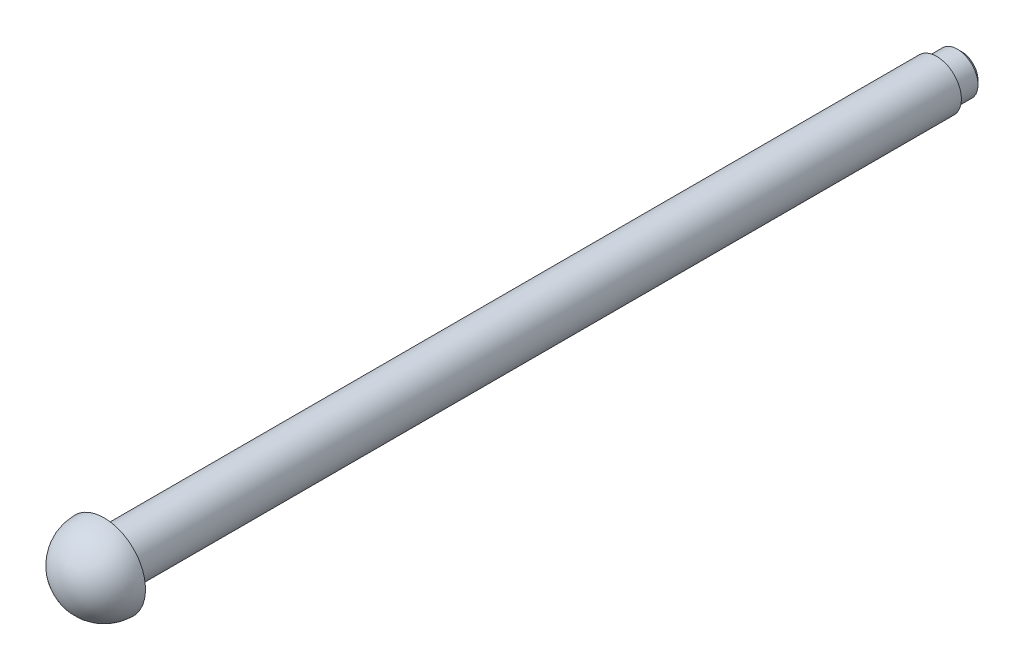
ISO-10303-21;
HEADER;
FILE_DESCRIPTION(('STEP AP214'),'2;1');
FILE_NAME('part.step','',(''),(''),'','','');
FILE_SCHEMA(('AUTOMOTIVE_DESIGN { 1 0 10303 214 1 1 1 1 }'));
ENDSEC;
DATA;
#1=APPLICATION_CONTEXT('core data for automotive mechanical design processes');
#2=APPLICATION_PROTOCOL_DEFINITION('international standard','automotive_design',2000,#1);
#3=PRODUCT_CONTEXT('',#1,'mechanical');
#4=PRODUCT('Part','Part','',(#3));
#5=PRODUCT_RELATED_PRODUCT_CATEGORY('part','',(#4));
#6=PRODUCT_DEFINITION_FORMATION('','',#4);
#7=PRODUCT_DEFINITION_CONTEXT('part definition',#1,'design');
#8=PRODUCT_DEFINITION('design','',#6,#7);
#9=PRODUCT_DEFINITION_SHAPE('','',#8);
#10=(LENGTH_UNIT() NAMED_UNIT(*) SI_UNIT(.MILLI.,.METRE.));
#11=(NAMED_UNIT(*) PLANE_ANGLE_UNIT() SI_UNIT($,.RADIAN.));
#12=(NAMED_UNIT(*) SI_UNIT($,.STERADIAN.) SOLID_ANGLE_UNIT());
#13=UNCERTAINTY_MEASURE_WITH_UNIT(LENGTH_MEASURE(1.E-05),#10,'distance_accuracy_value','');
#14=(GEOMETRIC_REPRESENTATION_CONTEXT(3) GLOBAL_UNCERTAINTY_ASSIGNED_CONTEXT((#13)) GLOBAL_UNIT_ASSIGNED_CONTEXT((#10,
#11,#12)) REPRESENTATION_CONTEXT('',''));
#15=CARTESIAN_POINT('',(0.,0.,0.));
#16=DIRECTION('',(0.,0.,1.));
#17=DIRECTION('',(1.,0.,0.));
#18=AXIS2_PLACEMENT_3D('',#15,#16,#17);
#19=CARTESIAN_POINT('',(0.,0.,0.));
#20=DIRECTION('',(0.,0.,1.));
#21=DIRECTION('',(0.,1.,0.));
#22=AXIS2_PLACEMENT_3D('',#19,#20,#21);
#23=SPHERICAL_SURFACE('',#22,2.5);
#24=CARTESIAN_POINT('',(0.,0.,0.));
#25=DIRECTION('',(0.,0.,1.));
#26=DIRECTION('',(1.,0.,0.));
#27=AXIS2_PLACEMENT_3D('',#24,#25,#26);
#28=CIRCLE('',#27,2.5);
#29=CARTESIAN_POINT('',(2.5,0.,0.));
#30=VERTEX_POINT('',#29);
#31=EDGE_CURVE('E43',#30,#30,#28,.T.);
#32=ORIENTED_EDGE('',*,*,#31,.T.);
#33=EDGE_LOOP('',(#32));
#34=FACE_BOUND('',#33,.T.);
#35=ADVANCED_FACE('F37',(#34),#23,.T.);
#36=CARTESIAN_POINT('',(0.,0.,65.917114171935));
#37=DIRECTION('',(0.,0.,1.));
#38=DIRECTION('',(1.,0.,0.));
#39=AXIS2_PLACEMENT_3D('',#36,#37,#38);
#40=CYLINDRICAL_SURFACE('',#39,1.49);
#41=CARTESIAN_POINT('',(0.,0.,-50.4));
#42=DIRECTION('',(0.,0.,1.));
#43=DIRECTION('',(1.,0.,0.));
#44=AXIS2_PLACEMENT_3D('',#41,#42,#43);
#45=CIRCLE('',#44,1.49);
#46=CARTESIAN_POINT('',(1.49,0.,-50.4));
#47=VERTEX_POINT('',#46);
#48=EDGE_CURVE('E51',#47,#47,#45,.T.);
#49=ORIENTED_EDGE('',*,*,#48,.T.);
#50=EDGE_LOOP('',(#49));
#51=FACE_BOUND('',#50,.T.);
#52=CARTESIAN_POINT('',(0.,0.,0.));
#53=DIRECTION('',(0.,0.,1.));
#54=DIRECTION('',(1.,0.,0.));
#55=AXIS2_PLACEMENT_3D('',#52,#53,#54);
#56=CIRCLE('',#55,1.49);
#57=CARTESIAN_POINT('',(1.49,0.,0.));
#58=VERTEX_POINT('',#57);
#59=EDGE_CURVE('E10',#58,#58,#56,.T.);
#60=ORIENTED_EDGE('',*,*,#59,.F.);
#61=EDGE_LOOP('',(#60));
#62=FACE_BOUND('',#61,.T.);
#63=ADVANCED_FACE('F78',(#51,#62),#40,.T.);
#64=CARTESIAN_POINT('',(0.,1.49,0.));
#65=DIRECTION('',(0.,0.,1.));
#66=DIRECTION('',(1.,0.,0.));
#67=AXIS2_PLACEMENT_3D('',#64,#65,#66);
#68=PLANE('',#67);
#69=ORIENTED_EDGE('',*,*,#31,.F.);
#70=EDGE_LOOP('',(#69));
#71=FACE_BOUND('',#70,.T.);
#72=ORIENTED_EDGE('',*,*,#59,.T.);
#73=EDGE_LOOP('',(#72));
#74=FACE_BOUND('',#73,.T.);
#75=ADVANCED_FACE('F83',(#71,#74),#68,.F.);
#76=CARTESIAN_POINT('',(0.,0.,-51.9));
#77=DIRECTION('',(0.,0.,1.));
#78=DIRECTION('',(1.,0.,0.));
#79=AXIS2_PLACEMENT_3D('',#76,#77,#78);
#80=CYLINDRICAL_SURFACE('',#79,1.25);
#81=CARTESIAN_POINT('',(0.,0.,-50.4));
#82=DIRECTION('',(0.,0.,1.));
#83=DIRECTION('',(1.,0.,0.));
#84=AXIS2_PLACEMENT_3D('',#81,#82,#83);
#85=CIRCLE('',#84,1.25);
#86=CARTESIAN_POINT('',(1.25,0.,-50.4));
#87=VERTEX_POINT('',#86);
#88=EDGE_CURVE('E47',#87,#87,#85,.T.);
#89=ORIENTED_EDGE('',*,*,#88,.F.);
#90=EDGE_LOOP('',(#89));
#91=FACE_BOUND('',#90,.T.);
#92=CARTESIAN_POINT('',(0.,0.,-51.6465));
#93=DIRECTION('',(0.,0.,1.));
#94=DIRECTION('',(1.,0.,0.));
#95=AXIS2_PLACEMENT_3D('',#92,#93,#94);
#96=CIRCLE('',#95,1.25);
#97=CARTESIAN_POINT('',(1.25,0.,-51.6465));
#98=VERTEX_POINT('',#97);
#99=EDGE_CURVE('E59',#98,#98,#96,.T.);
#100=ORIENTED_EDGE('',*,*,#99,.T.);
#101=EDGE_LOOP('',(#100));
#102=FACE_BOUND('',#101,.T.);
#103=ADVANCED_FACE('F63',(#91,#102),#80,.T.);
#104=CARTESIAN_POINT('',(1.25,0.,-50.4));
#105=DIRECTION('',(0.,0.,1.));
#106=DIRECTION('',(1.,0.,0.));
#107=AXIS2_PLACEMENT_3D('',#104,#105,#106);
#108=PLANE('',#107);
#109=ORIENTED_EDGE('',*,*,#48,.F.);
#110=EDGE_LOOP('',(#109));
#111=FACE_BOUND('',#110,.T.);
#112=ORIENTED_EDGE('',*,*,#88,.T.);
#113=EDGE_LOOP('',(#112));
#114=FACE_BOUND('',#113,.T.);
#115=ADVANCED_FACE('F69',(#111,#114),#108,.F.);
#116=CARTESIAN_POINT('',(0.,0.,-51.9));
#117=DIRECTION('',(0.,0.,1.));
#118=DIRECTION('',(1.,0.,0.));
#119=AXIS2_PLACEMENT_3D('',#116,#117,#118);
#120=CONICAL_SURFACE('',#119,0.996500000000001,0.785398163397465);
#121=ORIENTED_EDGE('',*,*,#99,.F.);
#122=EDGE_LOOP('',(#121));
#123=FACE_BOUND('',#122,.T.);
#124=CARTESIAN_POINT('',(0.,0.,-51.9));
#125=DIRECTION('',(0.,0.,1.));
#126=DIRECTION('',(1.,0.,0.));
#127=AXIS2_PLACEMENT_3D('',#124,#125,#126);
#128=CIRCLE('',#127,0.996500000000001);
#129=CARTESIAN_POINT('',(0.996500000000001,0.,-51.9));
#130=VERTEX_POINT('',#129);
#131=EDGE_CURVE('E56',#130,#130,#128,.T.);
#132=ORIENTED_EDGE('',*,*,#131,.T.);
#133=EDGE_LOOP('',(#132));
#134=FACE_BOUND('',#133,.T.);
#135=ADVANCED_FACE('F65',(#123,#134),#120,.T.);
#136=CARTESIAN_POINT('',(0.,1.49,-51.9));
#137=DIRECTION('',(0.,0.,1.));
#138=DIRECTION('',(1.,0.,0.));
#139=AXIS2_PLACEMENT_3D('',#136,#137,#138);
#140=PLANE('',#139);
#141=ORIENTED_EDGE('',*,*,#131,.F.);
#142=EDGE_LOOP('',(#141));
#143=FACE_BOUND('',#142,.T.);
#144=ADVANCED_FACE('F68',(#143),#140,.F.);
#145=CLOSED_SHELL('',(#35,#63,#75,#103,#115,#135,#144));
#146=MANIFOLD_SOLID_BREP('B2',#145);
#147=ADVANCED_BREP_SHAPE_REPRESENTATION('',(#18,#146),#14);
#148=SHAPE_DEFINITION_REPRESENTATION(#9,#147);
ENDSEC;
END-ISO-10303-21;
